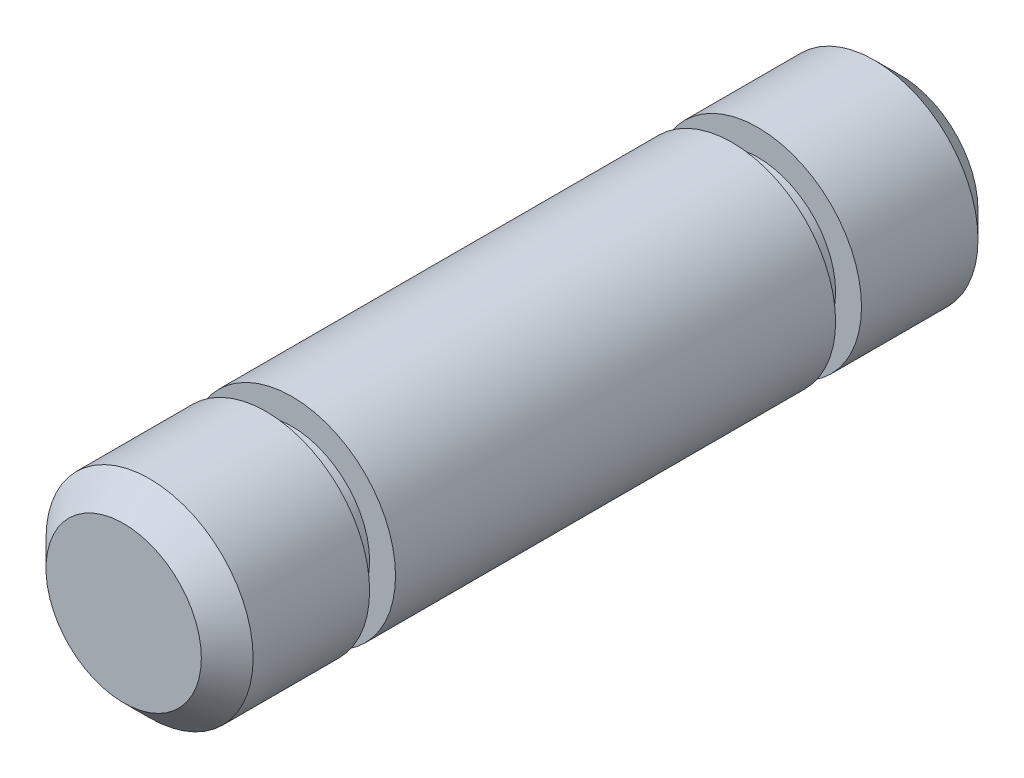
ISO-10303-21;
HEADER;
FILE_DESCRIPTION(('STEP AP214'),'2;1');
FILE_NAME('part.step','',(''),(''),'','','');
FILE_SCHEMA(('AUTOMOTIVE_DESIGN { 1 0 10303 214 1 1 1 1 }'));
ENDSEC;
DATA;
#1=APPLICATION_CONTEXT('core data for automotive mechanical design processes');
#2=APPLICATION_PROTOCOL_DEFINITION('international standard','automotive_design',2000,#1);
#3=PRODUCT_CONTEXT('',#1,'mechanical');
#4=PRODUCT('Part','Part','',(#3));
#5=PRODUCT_RELATED_PRODUCT_CATEGORY('part','',(#4));
#6=PRODUCT_DEFINITION_FORMATION('','',#4);
#7=PRODUCT_DEFINITION_CONTEXT('part definition',#1,'design');
#8=PRODUCT_DEFINITION('design','',#6,#7);
#9=PRODUCT_DEFINITION_SHAPE('','',#8);
#10=(LENGTH_UNIT() NAMED_UNIT(*) SI_UNIT(.MILLI.,.METRE.));
#11=(NAMED_UNIT(*) PLANE_ANGLE_UNIT() SI_UNIT($,.RADIAN.));
#12=(NAMED_UNIT(*) SI_UNIT($,.STERADIAN.) SOLID_ANGLE_UNIT());
#13=UNCERTAINTY_MEASURE_WITH_UNIT(LENGTH_MEASURE(1.E-05),#10,'distance_accuracy_value','');
#14=(GEOMETRIC_REPRESENTATION_CONTEXT(3) GLOBAL_UNCERTAINTY_ASSIGNED_CONTEXT((#13)) GLOBAL_UNIT_ASSIGNED_CONTEXT((#10,
#11,#12)) REPRESENTATION_CONTEXT('',''));
#15=CARTESIAN_POINT('',(0.,0.,0.));
#16=DIRECTION('',(0.,0.,1.));
#17=DIRECTION('',(1.,0.,0.));
#18=AXIS2_PLACEMENT_3D('',#15,#16,#17);
#19=CARTESIAN_POINT('',(0.,0.,60.));
#20=DIRECTION('',(0.,0.,-1.));
#21=DIRECTION('',(-1.,0.,0.));
#22=AXIS2_PLACEMENT_3D('',#19,#20,#21);
#23=CYLINDRICAL_SURFACE('',#22,8.);
#24=CARTESIAN_POINT('',(0.,0.,13.));
#25=DIRECTION('',(0.,0.,1.));
#26=DIRECTION('',(1.,0.,0.));
#27=AXIS2_PLACEMENT_3D('',#24,#25,#26);
#28=CIRCLE('',#27,8.);
#29=CARTESIAN_POINT('',(8.,0.,13.));
#30=VERTEX_POINT('',#29);
#31=EDGE_CURVE('E61',#30,#30,#28,.T.);
#32=ORIENTED_EDGE('',*,*,#31,.T.);
#33=EDGE_LOOP('',(#32));
#34=FACE_BOUND('',#33,.T.);
#35=CARTESIAN_POINT('',(0.,0.,47.));
#36=DIRECTION('',(0.,0.,1.));
#37=DIRECTION('',(1.,0.,0.));
#38=AXIS2_PLACEMENT_3D('',#35,#36,#37);
#39=CIRCLE('',#38,8.);
#40=CARTESIAN_POINT('',(8.,0.,47.));
#41=VERTEX_POINT('',#40);
#42=EDGE_CURVE('E68',#41,#41,#39,.T.);
#43=ORIENTED_EDGE('',*,*,#42,.F.);
#44=EDGE_LOOP('',(#43));
#45=FACE_BOUND('',#44,.T.);
#46=ADVANCED_FACE('F43',(#34,#45),#23,.T.);
#47=CARTESIAN_POINT('',(0.,0.,2.00000000000002));
#48=DIRECTION('',(0.,0.,1.));
#49=DIRECTION('',(1.,0.,0.));
#50=AXIS2_PLACEMENT_3D('',#47,#48,#49);
#51=CIRCLE('',#50,8.);
#52=CARTESIAN_POINT('',(8.,0.,2.00000000000002));
#53=VERTEX_POINT('',#52);
#54=EDGE_CURVE('E57',#53,#53,#51,.T.);
#55=ORIENTED_EDGE('',*,*,#54,.T.);
#56=EDGE_LOOP('',(#55));
#57=FACE_BOUND('',#56,.T.);
#58=CARTESIAN_POINT('',(0.,0.,11.));
#59=DIRECTION('',(0.,0.,1.));
#60=DIRECTION('',(1.,0.,0.));
#61=AXIS2_PLACEMENT_3D('',#58,#59,#60);
#62=CIRCLE('',#61,8.);
#63=CARTESIAN_POINT('',(8.,0.,11.));
#64=VERTEX_POINT('',#63);
#65=EDGE_CURVE('E64',#64,#64,#62,.T.);
#66=ORIENTED_EDGE('',*,*,#65,.F.);
#67=EDGE_LOOP('',(#66));
#68=FACE_BOUND('',#67,.T.);
#69=ADVANCED_FACE('F91',(#57,#68),#23,.T.);
#70=CARTESIAN_POINT('',(0.,0.,0.));
#71=DIRECTION('',(0.,0.,1.));
#72=DIRECTION('',(1.,0.,0.));
#73=AXIS2_PLACEMENT_3D('',#70,#71,#72);
#74=PLANE('',#73);
#75=CARTESIAN_POINT('',(0.,0.,0.));
#76=DIRECTION('',(0.,0.,1.));
#77=DIRECTION('',(1.,0.,0.));
#78=AXIS2_PLACEMENT_3D('',#75,#76,#77);
#79=CIRCLE('',#78,5.99999999999997);
#80=CARTESIAN_POINT('',(5.99999999999997,0.,0.));
#81=VERTEX_POINT('',#80);
#82=EDGE_CURVE('E52',#81,#81,#79,.F.);
#83=ORIENTED_EDGE('',*,*,#82,.T.);
#84=EDGE_LOOP('',(#83));
#85=FACE_BOUND('',#84,.T.);
#86=ADVANCED_FACE('F97',(#85),#74,.F.);
#87=CARTESIAN_POINT('',(0.,0.,2.00000000000002));
#88=DIRECTION('',(0.,0.,1.));
#89=DIRECTION('',(1.,0.,0.));
#90=AXIS2_PLACEMENT_3D('',#87,#88,#89);
#91=CONICAL_SURFACE('',#90,8.,0.78539816339745);
#92=ORIENTED_EDGE('',*,*,#82,.F.);
#93=EDGE_LOOP('',(#92));
#94=FACE_BOUND('',#93,.T.);
#95=ORIENTED_EDGE('',*,*,#54,.F.);
#96=EDGE_LOOP('',(#95));
#97=FACE_BOUND('',#96,.T.);
#98=ADVANCED_FACE('F94',(#94,#97),#91,.T.);
#99=CARTESIAN_POINT('',(0.,0.,11.));
#100=DIRECTION('',(0.,0.,1.));
#101=DIRECTION('',(1.,0.,0.));
#102=AXIS2_PLACEMENT_3D('',#99,#100,#101);
#103=PLANE('',#102);
#104=CARTESIAN_POINT('',(0.,0.,11.));
#105=DIRECTION('',(0.,0.,1.));
#106=DIRECTION('',(1.,0.,0.));
#107=AXIS2_PLACEMENT_3D('',#104,#105,#106);
#108=CIRCLE('',#107,6.);
#109=CARTESIAN_POINT('',(6.,0.,11.));
#110=VERTEX_POINT('',#109);
#111=EDGE_CURVE('E65',#110,#110,#108,.T.);
#112=ORIENTED_EDGE('',*,*,#111,.F.);
#113=EDGE_LOOP('',(#112));
#114=FACE_BOUND('',#113,.T.);
#115=ORIENTED_EDGE('',*,*,#65,.T.);
#116=EDGE_LOOP('',(#115));
#117=FACE_BOUND('',#116,.T.);
#118=ADVANCED_FACE('F96',(#114,#117),#103,.T.);
#119=CARTESIAN_POINT('',(0.,0.,13.));
#120=DIRECTION('',(0.,0.,1.));
#121=DIRECTION('',(1.,0.,0.));
#122=AXIS2_PLACEMENT_3D('',#119,#120,#121);
#123=PLANE('',#122);
#124=CARTESIAN_POINT('',(0.,0.,13.));
#125=DIRECTION('',(0.,0.,1.));
#126=DIRECTION('',(1.,0.,0.));
#127=AXIS2_PLACEMENT_3D('',#124,#125,#126);
#128=CIRCLE('',#127,6.);
#129=CARTESIAN_POINT('',(6.,0.,13.));
#130=VERTEX_POINT('',#129);
#131=EDGE_CURVE('E74',#130,#130,#128,.T.);
#132=ORIENTED_EDGE('',*,*,#131,.T.);
#133=EDGE_LOOP('',(#132));
#134=FACE_BOUND('',#133,.T.);
#135=ORIENTED_EDGE('',*,*,#31,.F.);
#136=EDGE_LOOP('',(#135));
#137=FACE_BOUND('',#136,.T.);
#138=ADVANCED_FACE('F103',(#134,#137),#123,.F.);
#139=CARTESIAN_POINT('',(0.,0.,11.));
#140=DIRECTION('',(0.,0.,1.));
#141=DIRECTION('',(1.,0.,0.));
#142=AXIS2_PLACEMENT_3D('',#139,#140,#141);
#143=CYLINDRICAL_SURFACE('',#142,6.);
#144=ORIENTED_EDGE('',*,*,#111,.T.);
#145=EDGE_LOOP('',(#144));
#146=FACE_BOUND('',#145,.T.);
#147=ORIENTED_EDGE('',*,*,#131,.F.);
#148=EDGE_LOOP('',(#147));
#149=FACE_BOUND('',#148,.T.);
#150=ADVANCED_FACE('F133',(#146,#149),#143,.T.);
#151=CARTESIAN_POINT('',(0.,0.,49.));
#152=DIRECTION('',(0.,0.,1.));
#153=DIRECTION('',(1.,0.,0.));
#154=AXIS2_PLACEMENT_3D('',#151,#152,#153);
#155=PLANE('',#154);
#156=CARTESIAN_POINT('',(0.,0.,49.));
#157=DIRECTION('',(0.,0.,1.));
#158=DIRECTION('',(1.,0.,0.));
#159=AXIS2_PLACEMENT_3D('',#156,#157,#158);
#160=CIRCLE('',#159,6.);
#161=CARTESIAN_POINT('',(6.,0.,49.));
#162=VERTEX_POINT('',#161);
#163=EDGE_CURVE('E70',#162,#162,#160,.T.);
#164=ORIENTED_EDGE('',*,*,#163,.T.);
#165=EDGE_LOOP('',(#164));
#166=FACE_BOUND('',#165,.T.);
#167=CARTESIAN_POINT('',(0.,0.,49.));
#168=DIRECTION('',(0.,0.,1.));
#169=DIRECTION('',(1.,0.,0.));
#170=AXIS2_PLACEMENT_3D('',#167,#168,#169);
#171=CIRCLE('',#170,8.);
#172=CARTESIAN_POINT('',(8.,0.,49.));
#173=VERTEX_POINT('',#172);
#174=EDGE_CURVE('E48',#173,#173,#171,.T.);
#175=ORIENTED_EDGE('',*,*,#174,.F.);
#176=EDGE_LOOP('',(#175));
#177=FACE_BOUND('',#176,.T.);
#178=ADVANCED_FACE('F130',(#166,#177),#155,.F.);
#179=CARTESIAN_POINT('',(0.,0.,47.));
#180=DIRECTION('',(0.,0.,1.));
#181=DIRECTION('',(1.,0.,0.));
#182=AXIS2_PLACEMENT_3D('',#179,#180,#181);
#183=PLANE('',#182);
#184=CARTESIAN_POINT('',(0.,0.,47.));
#185=DIRECTION('',(0.,0.,1.));
#186=DIRECTION('',(1.,0.,0.));
#187=AXIS2_PLACEMENT_3D('',#184,#185,#186);
#188=CIRCLE('',#187,6.);
#189=CARTESIAN_POINT('',(6.,0.,47.));
#190=VERTEX_POINT('',#189);
#191=EDGE_CURVE('E76',#190,#190,#188,.T.);
#192=ORIENTED_EDGE('',*,*,#191,.F.);
#193=EDGE_LOOP('',(#192));
#194=FACE_BOUND('',#193,.T.);
#195=ORIENTED_EDGE('',*,*,#42,.T.);
#196=EDGE_LOOP('',(#195));
#197=FACE_BOUND('',#196,.T.);
#198=ADVANCED_FACE('F132',(#194,#197),#183,.T.);
#199=CARTESIAN_POINT('',(0.,0.,49.));
#200=DIRECTION('',(0.,0.,-1.));
#201=DIRECTION('',(-1.,0.,0.));
#202=AXIS2_PLACEMENT_3D('',#199,#200,#201);
#203=CYLINDRICAL_SURFACE('',#202,6.);
#204=ORIENTED_EDGE('',*,*,#163,.F.);
#205=EDGE_LOOP('',(#204));
#206=FACE_BOUND('',#205,.T.);
#207=ORIENTED_EDGE('',*,*,#191,.T.);
#208=EDGE_LOOP('',(#207));
#209=FACE_BOUND('',#208,.T.);
#210=ADVANCED_FACE('F139',(#206,#209),#203,.T.);
#211=CARTESIAN_POINT('',(0.,0.,60.));
#212=DIRECTION('',(0.,0.,1.));
#213=DIRECTION('',(1.,0.,0.));
#214=AXIS2_PLACEMENT_3D('',#211,#212,#213);
#215=PLANE('',#214);
#216=CARTESIAN_POINT('',(0.,0.,60.));
#217=DIRECTION('',(0.,0.,1.));
#218=DIRECTION('',(1.,0.,0.));
#219=AXIS2_PLACEMENT_3D('',#216,#217,#218);
#220=CIRCLE('',#219,6.);
#221=CARTESIAN_POINT('',(6.,0.,60.));
#222=VERTEX_POINT('',#221);
#223=EDGE_CURVE('E11',#222,#222,#220,.T.);
#224=ORIENTED_EDGE('',*,*,#223,.T.);
#225=EDGE_LOOP('',(#224));
#226=FACE_BOUND('',#225,.T.);
#227=ADVANCED_FACE('F123',(#226),#215,.T.);
#228=CARTESIAN_POINT('',(0.,0.,60.));
#229=DIRECTION('',(0.,0.,-1.));
#230=DIRECTION('',(-1.,0.,0.));
#231=AXIS2_PLACEMENT_3D('',#228,#229,#230);
#232=CONICAL_SURFACE('',#231,6.,0.785398163397447);
#233=CARTESIAN_POINT('',(0.,0.,58.));
#234=DIRECTION('',(0.,0.,1.));
#235=DIRECTION('',(1.,0.,0.));
#236=AXIS2_PLACEMENT_3D('',#233,#234,#235);
#237=CIRCLE('',#236,8.);
#238=CARTESIAN_POINT('',(8.,0.,58.));
#239=VERTEX_POINT('',#238);
#240=EDGE_CURVE('E67',#239,#239,#237,.F.);
#241=ORIENTED_EDGE('',*,*,#240,.F.);
#242=EDGE_LOOP('',(#241));
#243=FACE_BOUND('',#242,.T.);
#244=ORIENTED_EDGE('',*,*,#223,.F.);
#245=EDGE_LOOP('',(#244));
#246=FACE_BOUND('',#245,.T.);
#247=ADVANCED_FACE('F46',(#243,#246),#232,.T.);
#248=ORIENTED_EDGE('',*,*,#174,.T.);
#249=EDGE_LOOP('',(#248));
#250=FACE_BOUND('',#249,.T.);
#251=ORIENTED_EDGE('',*,*,#240,.T.);
#252=EDGE_LOOP('',(#251));
#253=FACE_BOUND('',#252,.T.);
#254=ADVANCED_FACE('F113',(#250,#253),#23,.T.);
#255=CLOSED_SHELL('',(#46,#69,#86,#98,#118,#138,#150,#178,#198,#210,#227,#247,#254));
#256=MANIFOLD_SOLID_BREP('B2',#255);
#257=ADVANCED_BREP_SHAPE_REPRESENTATION('',(#18,#256),#14);
#258=SHAPE_DEFINITION_REPRESENTATION(#9,#257);
ENDSEC;
END-ISO-10303-21;
